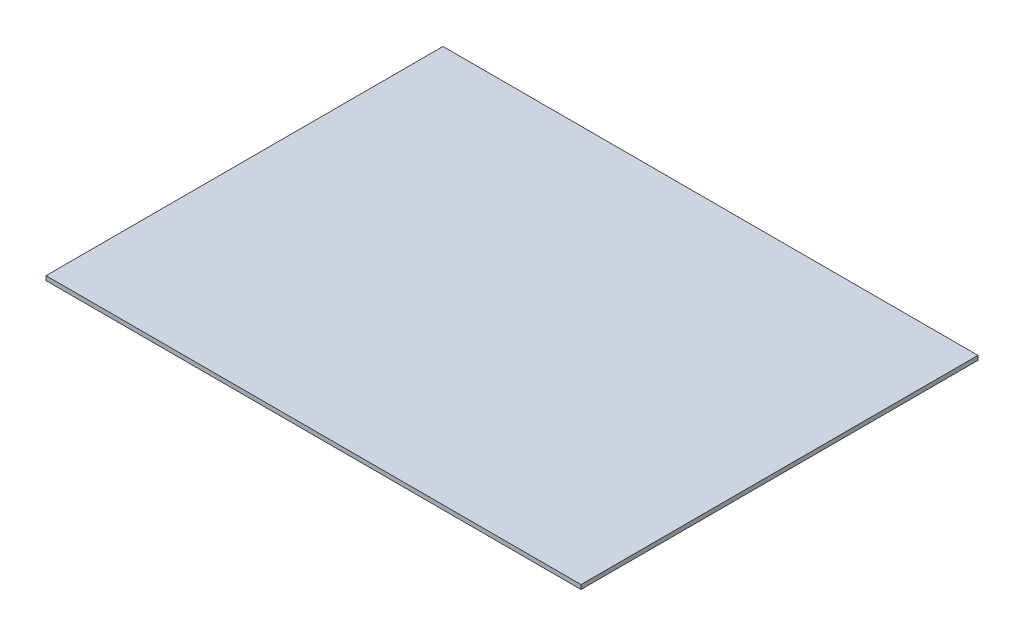
ISO-10303-21;
HEADER;
FILE_DESCRIPTION(('STEP AP214'),'2;1');
FILE_NAME('part.step','',(''),(''),'','','');
FILE_SCHEMA(('AUTOMOTIVE_DESIGN { 1 0 10303 214 1 1 1 1 }'));
ENDSEC;
DATA;
#1=APPLICATION_CONTEXT('core data for automotive mechanical design processes');
#2=APPLICATION_PROTOCOL_DEFINITION('international standard','automotive_design',2000,#1);
#3=PRODUCT_CONTEXT('',#1,'mechanical');
#4=PRODUCT('Part','Part','',(#3));
#5=PRODUCT_RELATED_PRODUCT_CATEGORY('part','',(#4));
#6=PRODUCT_DEFINITION_FORMATION('','',#4);
#7=PRODUCT_DEFINITION_CONTEXT('part definition',#1,'design');
#8=PRODUCT_DEFINITION('design','',#6,#7);
#9=PRODUCT_DEFINITION_SHAPE('','',#8);
#10=(LENGTH_UNIT() NAMED_UNIT(*) SI_UNIT(.MILLI.,.METRE.));
#11=(NAMED_UNIT(*) PLANE_ANGLE_UNIT() SI_UNIT($,.RADIAN.));
#12=(NAMED_UNIT(*) SI_UNIT($,.STERADIAN.) SOLID_ANGLE_UNIT());
#13=UNCERTAINTY_MEASURE_WITH_UNIT(LENGTH_MEASURE(1.E-05),#10,'distance_accuracy_value','');
#14=(GEOMETRIC_REPRESENTATION_CONTEXT(3) GLOBAL_UNCERTAINTY_ASSIGNED_CONTEXT((#13)) GLOBAL_UNIT_ASSIGNED_CONTEXT((#10,
#11,#12)) REPRESENTATION_CONTEXT('',''));
#15=CARTESIAN_POINT('',(0.,0.,0.));
#16=DIRECTION('',(0.,0.,1.));
#17=DIRECTION('',(1.,0.,0.));
#18=AXIS2_PLACEMENT_3D('',#15,#16,#17);
#19=CARTESIAN_POINT('',(0.,3.175,0.));
#20=DIRECTION('',(1.,0.,0.));
#21=DIRECTION('',(0.,0.,-1.));
#22=AXIS2_PLACEMENT_3D('',#19,#20,#21);
#23=PLANE('',#22);
#24=DIRECTION('',(0.,0.,1.));
#25=VECTOR('',#24,1.);
#26=CARTESIAN_POINT('',(0.,0.,0.));
#27=LINE('',#26,#25);
#28=CARTESIAN_POINT('',(0.,0.,-292.1));
#29=VERTEX_POINT('',#28);
#30=CARTESIAN_POINT('',(0.,0.,0.));
#31=VERTEX_POINT('',#30);
#32=EDGE_CURVE('E96',#29,#31,#27,.T.);
#33=ORIENTED_EDGE('',*,*,#32,.T.);
#34=DIRECTION('',(0.,-1.,0.));
#35=VECTOR('',#34,1.);
#36=CARTESIAN_POINT('',(0.,3.175,0.));
#37=LINE('',#36,#35);
#38=CARTESIAN_POINT('',(0.,3.175,0.));
#39=VERTEX_POINT('',#38);
#40=EDGE_CURVE('E11',#39,#31,#37,.T.);
#41=ORIENTED_EDGE('',*,*,#40,.F.);
#42=DIRECTION('',(0.,0.,1.));
#43=VECTOR('',#42,1.);
#44=CARTESIAN_POINT('',(0.,3.175,0.));
#45=LINE('',#44,#43);
#46=CARTESIAN_POINT('',(0.,3.175,-292.1));
#47=VERTEX_POINT('',#46);
#48=EDGE_CURVE('E84',#47,#39,#45,.T.);
#49=ORIENTED_EDGE('',*,*,#48,.F.);
#50=DIRECTION('',(0.,-1.,0.));
#51=VECTOR('',#50,1.);
#52=CARTESIAN_POINT('',(0.,3.175,-292.1));
#53=LINE('',#52,#51);
#54=EDGE_CURVE('E92',#47,#29,#53,.T.);
#55=ORIENTED_EDGE('',*,*,#54,.T.);
#56=EDGE_LOOP('',(#33,#41,#49,#55));
#57=FACE_BOUND('',#56,.T.);
#58=ADVANCED_FACE('F33',(#57),#23,.F.);
#59=CARTESIAN_POINT('',(0.,3.175,0.));
#60=DIRECTION('',(0.,0.,-1.));
#61=DIRECTION('',(-1.,0.,0.));
#62=AXIS2_PLACEMENT_3D('',#59,#60,#61);
#63=PLANE('',#62);
#64=DIRECTION('',(1.,0.,0.));
#65=VECTOR('',#64,1.);
#66=CARTESIAN_POINT('',(0.,0.,0.));
#67=LINE('',#66,#65);
#68=CARTESIAN_POINT('',(393.7,0.,0.));
#69=VERTEX_POINT('',#68);
#70=EDGE_CURVE('E88',#31,#69,#67,.T.);
#71=ORIENTED_EDGE('',*,*,#70,.T.);
#72=DIRECTION('',(0.,-1.,0.));
#73=VECTOR('',#72,1.);
#74=CARTESIAN_POINT('',(393.7,3.175,0.));
#75=LINE('',#74,#73);
#76=CARTESIAN_POINT('',(393.7,3.175,0.));
#77=VERTEX_POINT('',#76);
#78=EDGE_CURVE('E41',#77,#69,#75,.T.);
#79=ORIENTED_EDGE('',*,*,#78,.F.);
#80=DIRECTION('',(1.,0.,0.));
#81=VECTOR('',#80,1.);
#82=CARTESIAN_POINT('',(0.,3.175,0.));
#83=LINE('',#82,#81);
#84=EDGE_CURVE('E79',#39,#77,#83,.T.);
#85=ORIENTED_EDGE('',*,*,#84,.F.);
#86=ORIENTED_EDGE('',*,*,#40,.T.);
#87=EDGE_LOOP('',(#71,#79,#85,#86));
#88=FACE_BOUND('',#87,.T.);
#89=ADVANCED_FACE('F87',(#88),#63,.F.);
#90=CARTESIAN_POINT('',(393.7,3.175,0.));
#91=DIRECTION('',(-1.,0.,0.));
#92=DIRECTION('',(0.,0.,1.));
#93=AXIS2_PLACEMENT_3D('',#90,#91,#92);
#94=PLANE('',#93);
#95=DIRECTION('',(0.,0.,-1.));
#96=VECTOR('',#95,1.);
#97=CARTESIAN_POINT('',(393.7,0.,0.));
#98=LINE('',#97,#96);
#99=CARTESIAN_POINT('',(393.7,0.,-292.1));
#100=VERTEX_POINT('',#99);
#101=EDGE_CURVE('E66',#69,#100,#98,.T.);
#102=ORIENTED_EDGE('',*,*,#101,.T.);
#103=DIRECTION('',(0.,-1.,0.));
#104=VECTOR('',#103,1.);
#105=CARTESIAN_POINT('',(393.7,3.175,-292.1));
#106=LINE('',#105,#104);
#107=CARTESIAN_POINT('',(393.7,3.175,-292.1));
#108=VERTEX_POINT('',#107);
#109=EDGE_CURVE('E89',#108,#100,#106,.T.);
#110=ORIENTED_EDGE('',*,*,#109,.F.);
#111=DIRECTION('',(0.,0.,-1.));
#112=VECTOR('',#111,1.);
#113=CARTESIAN_POINT('',(393.7,3.175,0.));
#114=LINE('',#113,#112);
#115=EDGE_CURVE('E82',#77,#108,#114,.T.);
#116=ORIENTED_EDGE('',*,*,#115,.F.);
#117=ORIENTED_EDGE('',*,*,#78,.T.);
#118=EDGE_LOOP('',(#102,#110,#116,#117));
#119=FACE_BOUND('',#118,.T.);
#120=ADVANCED_FACE('F90',(#119),#94,.F.);
#121=CARTESIAN_POINT('',(0.,3.175,-292.1));
#122=DIRECTION('',(0.,0.,1.));
#123=DIRECTION('',(1.,0.,0.));
#124=AXIS2_PLACEMENT_3D('',#121,#122,#123);
#125=PLANE('',#124);
#126=DIRECTION('',(-1.,0.,0.));
#127=VECTOR('',#126,1.);
#128=CARTESIAN_POINT('',(0.,0.,-292.1));
#129=LINE('',#128,#127);
#130=EDGE_CURVE('E72',#100,#29,#129,.T.);
#131=ORIENTED_EDGE('',*,*,#130,.T.);
#132=ORIENTED_EDGE('',*,*,#54,.F.);
#133=DIRECTION('',(-1.,0.,0.));
#134=VECTOR('',#133,1.);
#135=CARTESIAN_POINT('',(0.,3.175,-292.1));
#136=LINE('',#135,#134);
#137=EDGE_CURVE('E49',#108,#47,#136,.T.);
#138=ORIENTED_EDGE('',*,*,#137,.F.);
#139=ORIENTED_EDGE('',*,*,#109,.T.);
#140=EDGE_LOOP('',(#131,#132,#138,#139));
#141=FACE_BOUND('',#140,.T.);
#142=ADVANCED_FACE('F103',(#141),#125,.F.);
#143=CARTESIAN_POINT('',(0.,3.175,0.));
#144=DIRECTION('',(0.,-1.,0.));
#145=DIRECTION('',(0.,0.,-1.));
#146=AXIS2_PLACEMENT_3D('',#143,#144,#145);
#147=PLANE('',#146);
#148=ORIENTED_EDGE('',*,*,#48,.T.);
#149=ORIENTED_EDGE('',*,*,#84,.T.);
#150=ORIENTED_EDGE('',*,*,#115,.T.);
#151=ORIENTED_EDGE('',*,*,#137,.T.);
#152=EDGE_LOOP('',(#148,#149,#150,#151));
#153=FACE_BOUND('',#152,.T.);
#154=ADVANCED_FACE('F80',(#153),#147,.F.);
#155=CARTESIAN_POINT('',(0.,0.,0.));
#156=DIRECTION('',(0.,-1.,0.));
#157=DIRECTION('',(0.,0.,-1.));
#158=AXIS2_PLACEMENT_3D('',#155,#156,#157);
#159=PLANE('',#158);
#160=ORIENTED_EDGE('',*,*,#32,.F.);
#161=ORIENTED_EDGE('',*,*,#130,.F.);
#162=ORIENTED_EDGE('',*,*,#101,.F.);
#163=ORIENTED_EDGE('',*,*,#70,.F.);
#164=EDGE_LOOP('',(#160,#161,#162,#163));
#165=FACE_BOUND('',#164,.T.);
#166=ADVANCED_FACE('F106',(#165),#159,.T.);
#167=CLOSED_SHELL('',(#58,#89,#120,#142,#154,#166));
#168=MANIFOLD_SOLID_BREP('B2',#167);
#169=ADVANCED_BREP_SHAPE_REPRESENTATION('',(#18,#168),#14);
#170=SHAPE_DEFINITION_REPRESENTATION(#9,#169);
ENDSEC;
END-ISO-10303-21;
